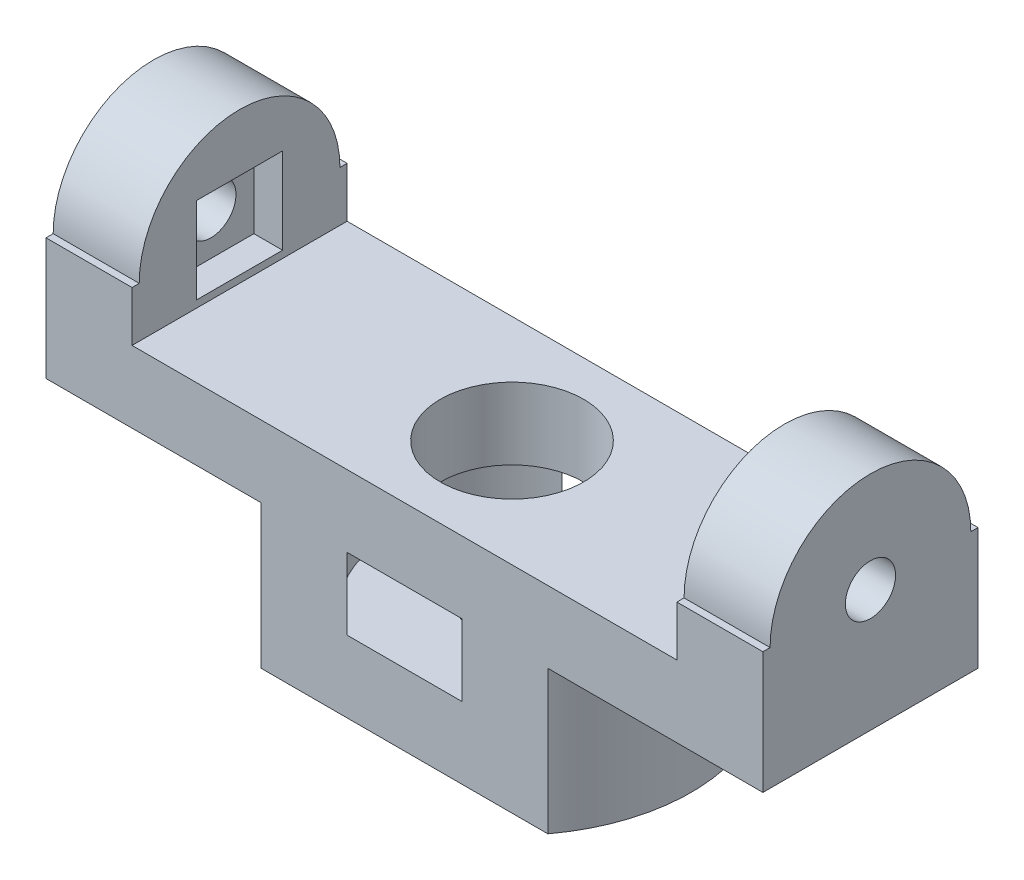
ISO-10303-21;
HEADER;
FILE_DESCRIPTION(('STEP AP214'),'2;1');
FILE_NAME('part.step','',(''),(''),'','','');
FILE_SCHEMA(('AUTOMOTIVE_DESIGN { 1 0 10303 214 1 1 1 1 }'));
ENDSEC;
DATA;
#1=APPLICATION_CONTEXT('core data for automotive mechanical design processes');
#2=APPLICATION_PROTOCOL_DEFINITION('international standard','automotive_design',2000,#1);
#3=PRODUCT_CONTEXT('',#1,'mechanical');
#4=PRODUCT('Part','Part','',(#3));
#5=PRODUCT_RELATED_PRODUCT_CATEGORY('part','',(#4));
#6=PRODUCT_DEFINITION_FORMATION('','',#4);
#7=PRODUCT_DEFINITION_CONTEXT('part definition',#1,'design');
#8=PRODUCT_DEFINITION('design','',#6,#7);
#9=PRODUCT_DEFINITION_SHAPE('','',#8);
#10=(LENGTH_UNIT() NAMED_UNIT(*) SI_UNIT(.MILLI.,.METRE.));
#11=(NAMED_UNIT(*) PLANE_ANGLE_UNIT() SI_UNIT($,.RADIAN.));
#12=(NAMED_UNIT(*) SI_UNIT($,.STERADIAN.) SOLID_ANGLE_UNIT());
#13=UNCERTAINTY_MEASURE_WITH_UNIT(LENGTH_MEASURE(1.E-05),#10,'distance_accuracy_value','');
#14=(GEOMETRIC_REPRESENTATION_CONTEXT(3) GLOBAL_UNCERTAINTY_ASSIGNED_CONTEXT((#13)) GLOBAL_UNIT_ASSIGNED_CONTEXT((#10,
#11,#12)) REPRESENTATION_CONTEXT('',''));
#15=CARTESIAN_POINT('',(0.,0.,0.));
#16=DIRECTION('',(0.,0.,1.));
#17=DIRECTION('',(1.,0.,0.));
#18=AXIS2_PLACEMENT_3D('',#15,#16,#17);
#19=CARTESIAN_POINT('',(0.,8.49999999999995,7.5));
#20=DIRECTION('',(1.,0.,0.));
#21=DIRECTION('',(0.,1.,0.));
#22=AXIS2_PLACEMENT_3D('',#19,#20,#21);
#23=CYLINDRICAL_SURFACE('',#22,1.75);
#24=CARTESIAN_POINT('',(0.,8.49999999999995,7.5));
#25=DIRECTION('',(1.,0.,0.));
#26=DIRECTION('',(0.,1.,0.));
#27=AXIS2_PLACEMENT_3D('',#24,#25,#26);
#28=CIRCLE('',#27,1.75);
#29=CARTESIAN_POINT('',(0.,10.25,7.5));
#30=VERTEX_POINT('',#29);
#31=EDGE_CURVE('E432',#30,#30,#28,.T.);
#32=ORIENTED_EDGE('',*,*,#31,.F.);
#33=EDGE_LOOP('',(#32));
#34=FACE_BOUND('',#33,.T.);
#35=CARTESIAN_POINT('',(4.,8.49999999999996,7.5));
#36=DIRECTION('',(1.,0.,0.));
#37=DIRECTION('',(0.,1.,0.));
#38=AXIS2_PLACEMENT_3D('',#35,#36,#37);
#39=CIRCLE('',#38,1.75);
#40=CARTESIAN_POINT('',(4.,10.25,7.5));
#41=VERTEX_POINT('',#40);
#42=EDGE_CURVE('E43',#41,#41,#39,.F.);
#43=ORIENTED_EDGE('',*,*,#42,.F.);
#44=EDGE_LOOP('',(#43));
#45=FACE_BOUND('',#44,.T.);
#46=ADVANCED_FACE('F39',(#34,#45),#23,.F.);
#47=CARTESIAN_POINT('',(50.,8.49999999999998,7.5));
#48=DIRECTION('',(1.,0.,0.));
#49=DIRECTION('',(0.,1.,0.));
#50=AXIS2_PLACEMENT_3D('',#47,#48,#49);
#51=CIRCLE('',#50,1.75);
#52=CARTESIAN_POINT('',(50.,10.25,7.5));
#53=VERTEX_POINT('',#52);
#54=EDGE_CURVE('E426',#53,#53,#51,.T.);
#55=ORIENTED_EDGE('',*,*,#54,.T.);
#56=EDGE_LOOP('',(#55));
#57=FACE_BOUND('',#56,.T.);
#58=CARTESIAN_POINT('',(46.,8.49999999999998,7.5));
#59=DIRECTION('',(-1.,0.,0.));
#60=DIRECTION('',(0.,-1.,0.));
#61=AXIS2_PLACEMENT_3D('',#58,#59,#60);
#62=CIRCLE('',#61,1.75);
#63=CARTESIAN_POINT('',(46.,6.74999999999997,7.5));
#64=VERTEX_POINT('',#63);
#65=EDGE_CURVE('E311',#64,#64,#62,.F.);
#66=ORIENTED_EDGE('',*,*,#65,.F.);
#67=EDGE_LOOP('',(#66));
#68=FACE_BOUND('',#67,.T.);
#69=ADVANCED_FACE('F541',(#57,#68),#23,.F.);
#70=CARTESIAN_POINT('',(25.,-10.,7.5));
#71=DIRECTION('',(0.,1.,0.));
#72=DIRECTION('',(-1.,0.,0.));
#73=AXIS2_PLACEMENT_3D('',#70,#71,#72);
#74=CYLINDRICAL_SURFACE('',#73,8.5);
#75=CARTESIAN_POINT('',(25.,-5.,7.5));
#76=DIRECTION('',(0.,-1.,0.));
#77=DIRECTION('',(1.,0.,0.));
#78=AXIS2_PLACEMENT_3D('',#75,#76,#77);
#79=CIRCLE('',#78,8.5);
#80=CARTESIAN_POINT('',(21.,-5.,0.));
#81=VERTEX_POINT('',#80);
#82=CARTESIAN_POINT('',(21.,-5.,15.));
#83=VERTEX_POINT('',#82);
#84=EDGE_CURVE('E341',#81,#83,#79,.F.);
#85=ORIENTED_EDGE('',*,*,#84,.F.);
#86=DIRECTION('',(0.,1.,0.));
#87=VECTOR('',#86,1.);
#88=CARTESIAN_POINT('',(21.,-10.,0.));
#89=LINE('',#88,#87);
#90=CARTESIAN_POINT('',(21.,0.,0.));
#91=VERTEX_POINT('',#90);
#92=EDGE_CURVE('E392',#81,#91,#89,.T.);
#93=ORIENTED_EDGE('',*,*,#92,.T.);
#94=CARTESIAN_POINT('',(25.,0.,7.5));
#95=DIRECTION('',(0.,1.,0.));
#96=DIRECTION('',(1.,0.,0.));
#97=AXIS2_PLACEMENT_3D('',#94,#95,#96);
#98=CIRCLE('',#97,8.5);
#99=CARTESIAN_POINT('',(21.,0.,15.));
#100=VERTEX_POINT('',#99);
#101=EDGE_CURVE('E374',#91,#100,#98,.T.);
#102=ORIENTED_EDGE('',*,*,#101,.T.);
#103=DIRECTION('',(0.,1.,0.));
#104=VECTOR('',#103,1.);
#105=CARTESIAN_POINT('',(21.,-10.,15.));
#106=LINE('',#105,#104);
#107=EDGE_CURVE('E389',#83,#100,#106,.T.);
#108=ORIENTED_EDGE('',*,*,#107,.F.);
#109=EDGE_LOOP('',(#85,#93,#102,#108));
#110=FACE_BOUND('',#109,.T.);
#111=ADVANCED_FACE('F543',(#110),#74,.F.);
#112=CARTESIAN_POINT('',(25.,-10.,7.5));
#113=DIRECTION('',(0.,1.,0.));
#114=DIRECTION('',(-1.,0.,0.));
#115=AXIS2_PLACEMENT_3D('',#112,#113,#114);
#116=CYLINDRICAL_SURFACE('',#115,8.5);
#117=CARTESIAN_POINT('',(25.,-5.,7.5));
#118=DIRECTION('',(0.,-1.,0.));
#119=DIRECTION('',(1.,0.,0.));
#120=AXIS2_PLACEMENT_3D('',#117,#118,#119);
#121=CIRCLE('',#120,8.5);
#122=CARTESIAN_POINT('',(29.,-5.,15.));
#123=VERTEX_POINT('',#122);
#124=CARTESIAN_POINT('',(29.,-5.,0.));
#125=VERTEX_POINT('',#124);
#126=EDGE_CURVE('E11',#123,#125,#121,.F.);
#127=ORIENTED_EDGE('',*,*,#126,.F.);
#128=DIRECTION('',(0.,1.,0.));
#129=VECTOR('',#128,1.);
#130=CARTESIAN_POINT('',(29.,-10.,15.));
#131=LINE('',#130,#129);
#132=CARTESIAN_POINT('',(29.,0.,15.));
#133=VERTEX_POINT('',#132);
#134=EDGE_CURVE('E362',#123,#133,#131,.T.);
#135=ORIENTED_EDGE('',*,*,#134,.T.);
#136=CARTESIAN_POINT('',(25.,0.,7.5));
#137=DIRECTION('',(0.,1.,0.));
#138=DIRECTION('',(1.,0.,0.));
#139=AXIS2_PLACEMENT_3D('',#136,#137,#138);
#140=CIRCLE('',#139,8.5);
#141=CARTESIAN_POINT('',(29.,0.,0.));
#142=VERTEX_POINT('',#141);
#143=EDGE_CURVE('E350',#133,#142,#140,.T.);
#144=ORIENTED_EDGE('',*,*,#143,.T.);
#145=DIRECTION('',(0.,1.,0.));
#146=VECTOR('',#145,1.);
#147=CARTESIAN_POINT('',(29.,-10.,0.));
#148=LINE('',#147,#146);
#149=EDGE_CURVE('E359',#125,#142,#148,.T.);
#150=ORIENTED_EDGE('',*,*,#149,.F.);
#151=EDGE_LOOP('',(#127,#135,#144,#150));
#152=FACE_BOUND('',#151,.T.);
#153=ADVANCED_FACE('F550',(#152),#116,.F.);
#154=CARTESIAN_POINT('',(50.,0.,15.));
#155=DIRECTION('',(0.,1.,0.));
#156=DIRECTION('',(-1.,0.,0.));
#157=AXIS2_PLACEMENT_3D('',#154,#155,#156);
#158=PLANE('',#157);
#159=CARTESIAN_POINT('',(25.,0.,7.5));
#160=DIRECTION('',(0.,-1.,0.));
#161=DIRECTION('',(1.,0.,0.));
#162=AXIS2_PLACEMENT_3D('',#159,#160,#161);
#163=CIRCLE('',#162,12.5);
#164=CARTESIAN_POINT('',(35.,0.,0.));
#165=VERTEX_POINT('',#164);
#166=CARTESIAN_POINT('',(35.,0.,15.));
#167=VERTEX_POINT('',#166);
#168=EDGE_CURVE('E344',#165,#167,#163,.T.);
#169=ORIENTED_EDGE('',*,*,#168,.F.);
#170=DIRECTION('',(1.,0.,0.));
#171=VECTOR('',#170,1.);
#172=CARTESIAN_POINT('',(50.,0.,0.));
#173=LINE('',#172,#171);
#174=CARTESIAN_POINT('',(50.,0.,0.));
#175=VERTEX_POINT('',#174);
#176=EDGE_CURVE('E463',#165,#175,#173,.T.);
#177=ORIENTED_EDGE('',*,*,#176,.T.);
#178=DIRECTION('',(0.,0.,-1.));
#179=VECTOR('',#178,1.);
#180=CARTESIAN_POINT('',(50.,0.,15.));
#181=LINE('',#180,#179);
#182=CARTESIAN_POINT('',(50.,0.,15.));
#183=VERTEX_POINT('',#182);
#184=EDGE_CURVE('E521',#183,#175,#181,.T.);
#185=ORIENTED_EDGE('',*,*,#184,.F.);
#186=DIRECTION('',(1.,0.,0.));
#187=VECTOR('',#186,1.);
#188=CARTESIAN_POINT('',(50.,0.,15.));
#189=LINE('',#188,#187);
#190=EDGE_CURVE('E470',#167,#183,#189,.T.);
#191=ORIENTED_EDGE('',*,*,#190,.F.);
#192=EDGE_LOOP('',(#169,#177,#185,#191));
#193=FACE_BOUND('',#192,.T.);
#194=ADVANCED_FACE('F590',(#193),#158,.F.);
#195=CARTESIAN_POINT('',(25.,0.,7.5));
#196=DIRECTION('',(0.,1.,0.));
#197=DIRECTION('',(-1.,0.,0.));
#198=AXIS2_PLACEMENT_3D('',#195,#196,#197);
#199=CIRCLE('',#198,5.);
#200=CARTESIAN_POINT('',(20.,0.,7.5));
#201=VERTEX_POINT('',#200);
#202=EDGE_CURVE('E324',#201,#201,#199,.F.);
#203=ORIENTED_EDGE('',*,*,#202,.F.);
#204=EDGE_LOOP('',(#203));
#205=FACE_BOUND('',#204,.T.);
#206=ORIENTED_EDGE('',*,*,#143,.F.);
#207=EDGE_CURVE('E469',#100,#133,#189,.T.);
#208=ORIENTED_EDGE('',*,*,#207,.F.);
#209=ORIENTED_EDGE('',*,*,#101,.F.);
#210=EDGE_CURVE('E493',#91,#142,#173,.T.);
#211=ORIENTED_EDGE('',*,*,#210,.T.);
#212=EDGE_LOOP('',(#206,#208,#209,#211));
#213=FACE_BOUND('',#212,.T.);
#214=ADVANCED_FACE('F588',(#205,#213),#158,.F.);
#215=CARTESIAN_POINT('',(25.,0.,7.5));
#216=DIRECTION('',(0.,-1.,0.));
#217=DIRECTION('',(1.,0.,0.));
#218=AXIS2_PLACEMENT_3D('',#215,#216,#217);
#219=CIRCLE('',#218,12.5);
#220=CARTESIAN_POINT('',(15.,0.,15.));
#221=VERTEX_POINT('',#220);
#222=CARTESIAN_POINT('',(15.,0.,0.));
#223=VERTEX_POINT('',#222);
#224=EDGE_CURVE('E368',#221,#223,#219,.T.);
#225=ORIENTED_EDGE('',*,*,#224,.F.);
#226=CARTESIAN_POINT('',(0.,0.,15.));
#227=VERTEX_POINT('',#226);
#228=EDGE_CURVE('E464',#227,#221,#189,.T.);
#229=ORIENTED_EDGE('',*,*,#228,.F.);
#230=DIRECTION('',(0.,0.,-1.));
#231=VECTOR('',#230,1.);
#232=CARTESIAN_POINT('',(0.,0.,15.));
#233=LINE('',#232,#231);
#234=CARTESIAN_POINT('',(0.,0.,0.));
#235=VERTEX_POINT('',#234);
#236=EDGE_CURVE('E487',#227,#235,#233,.T.);
#237=ORIENTED_EDGE('',*,*,#236,.T.);
#238=EDGE_CURVE('E488',#235,#223,#173,.T.);
#239=ORIENTED_EDGE('',*,*,#238,.T.);
#240=EDGE_LOOP('',(#225,#229,#237,#239));
#241=FACE_BOUND('',#240,.T.);
#242=ADVANCED_FACE('F41',(#241),#158,.F.);
#243=CARTESIAN_POINT('',(50.,16.,15.));
#244=DIRECTION('',(-1.,0.,0.));
#245=DIRECTION('',(0.,0.,1.));
#246=AXIS2_PLACEMENT_3D('',#243,#244,#245);
#247=PLANE('',#246);
#248=ORIENTED_EDGE('',*,*,#54,.F.);
#249=EDGE_LOOP('',(#248));
#250=FACE_BOUND('',#249,.T.);
#251=CARTESIAN_POINT('',(50.,8.49999999999998,7.5));
#252=DIRECTION('',(-1.,0.,0.));
#253=DIRECTION('',(0.,1.,0.));
#254=AXIS2_PLACEMENT_3D('',#251,#252,#253);
#255=CIRCLE('',#254,7.);
#256=CARTESIAN_POINT('',(50.,8.49999999999998,14.5));
#257=VERTEX_POINT('',#256);
#258=CARTESIAN_POINT('',(50.,8.49999999999998,0.5));
#259=VERTEX_POINT('',#258);
#260=EDGE_CURVE('E398',#257,#259,#255,.T.);
#261=ORIENTED_EDGE('',*,*,#260,.F.);
#262=DIRECTION('',(0.,0.,-1.));
#263=VECTOR('',#262,1.);
#264=CARTESIAN_POINT('',(50.,8.49999999999998,14.5));
#265=LINE('',#264,#263);
#266=CARTESIAN_POINT('',(50.,8.49999999999998,15.));
#267=VERTEX_POINT('',#266);
#268=EDGE_CURVE('E404',#267,#257,#265,.T.);
#269=ORIENTED_EDGE('',*,*,#268,.F.);
#270=DIRECTION('',(0.,1.,0.));
#271=VECTOR('',#270,1.);
#272=CARTESIAN_POINT('',(50.,16.,15.));
#273=LINE('',#272,#271);
#274=EDGE_CURVE('E468',#183,#267,#273,.T.);
#275=ORIENTED_EDGE('',*,*,#274,.F.);
#276=ORIENTED_EDGE('',*,*,#184,.T.);
#277=DIRECTION('',(0.,1.,0.));
#278=VECTOR('',#277,1.);
#279=CARTESIAN_POINT('',(50.,16.,0.));
#280=LINE('',#279,#278);
#281=CARTESIAN_POINT('',(50.,8.49999999999998,0.));
#282=VERTEX_POINT('',#281);
#283=EDGE_CURVE('E492',#175,#282,#280,.T.);
#284=ORIENTED_EDGE('',*,*,#283,.T.);
#285=DIRECTION('',(0.,0.,-1.));
#286=VECTOR('',#285,1.);
#287=CARTESIAN_POINT('',(50.,8.49999999999998,-5.90637808857718));
#288=LINE('',#287,#286);
#289=EDGE_CURVE('E416',#259,#282,#288,.T.);
#290=ORIENTED_EDGE('',*,*,#289,.F.);
#291=EDGE_LOOP('',(#261,#269,#275,#276,#284,#290));
#292=FACE_BOUND('',#291,.T.);
#293=ADVANCED_FACE('F581',(#250,#292),#247,.F.);
#294=CARTESIAN_POINT('',(44.,5.,15.));
#295=DIRECTION('',(1.,0.,0.));
#296=DIRECTION('',(0.,1.,0.));
#297=AXIS2_PLACEMENT_3D('',#294,#295,#296);
#298=PLANE('',#297);
#299=DIRECTION('',(0.,0.,-1.));
#300=VECTOR('',#299,1.);
#301=CARTESIAN_POINT('',(44.,11.4999999999999,4.5));
#302=LINE('',#301,#300);
#303=CARTESIAN_POINT('',(44.,11.4999999999999,10.5));
#304=VERTEX_POINT('',#303);
#305=CARTESIAN_POINT('',(44.,11.4999999999999,4.5));
#306=VERTEX_POINT('',#305);
#307=EDGE_CURVE('E297',#304,#306,#302,.T.);
#308=ORIENTED_EDGE('',*,*,#307,.F.);
#309=DIRECTION('',(0.,1.,0.));
#310=VECTOR('',#309,1.);
#311=CARTESIAN_POINT('',(44.,11.4999999999999,10.5));
#312=LINE('',#311,#310);
#313=CARTESIAN_POINT('',(44.,5.49999999999993,10.5));
#314=VERTEX_POINT('',#313);
#315=EDGE_CURVE('E65',#314,#304,#312,.T.);
#316=ORIENTED_EDGE('',*,*,#315,.F.);
#317=DIRECTION('',(0.,0.,1.));
#318=VECTOR('',#317,1.);
#319=CARTESIAN_POINT('',(44.,5.49999999999993,4.5));
#320=LINE('',#319,#318);
#321=CARTESIAN_POINT('',(44.,5.49999999999993,4.5));
#322=VERTEX_POINT('',#321);
#323=EDGE_CURVE('E282',#322,#314,#320,.T.);
#324=ORIENTED_EDGE('',*,*,#323,.F.);
#325=DIRECTION('',(0.,-1.,0.));
#326=VECTOR('',#325,1.);
#327=CARTESIAN_POINT('',(44.,11.4999999999999,4.5));
#328=LINE('',#327,#326);
#329=EDGE_CURVE('E301',#306,#322,#328,.T.);
#330=ORIENTED_EDGE('',*,*,#329,.F.);
#331=EDGE_LOOP('',(#308,#316,#324,#330));
#332=FACE_BOUND('',#331,.T.);
#333=DIRECTION('',(0.,-1.,0.));
#334=VECTOR('',#333,1.);
#335=CARTESIAN_POINT('',(44.,5.,15.));
#336=LINE('',#335,#334);
#337=CARTESIAN_POINT('',(44.,8.49999999999997,15.));
#338=VERTEX_POINT('',#337);
#339=CARTESIAN_POINT('',(44.,5.,15.));
#340=VERTEX_POINT('',#339);
#341=EDGE_CURVE('E474',#338,#340,#336,.T.);
#342=ORIENTED_EDGE('',*,*,#341,.F.);
#343=DIRECTION('',(0.,0.,-1.));
#344=VECTOR('',#343,1.);
#345=CARTESIAN_POINT('',(44.,8.49999999999997,15.));
#346=LINE('',#345,#344);
#347=CARTESIAN_POINT('',(44.,8.49999999999997,14.5));
#348=VERTEX_POINT('',#347);
#349=EDGE_CURVE('E451',#338,#348,#346,.T.);
#350=ORIENTED_EDGE('',*,*,#349,.T.);
#351=CARTESIAN_POINT('',(44.,8.49999999999997,7.5));
#352=DIRECTION('',(1.,0.,0.));
#353=DIRECTION('',(0.,1.,0.));
#354=AXIS2_PLACEMENT_3D('',#351,#352,#353);
#355=CIRCLE('',#354,7.);
#356=CARTESIAN_POINT('',(44.,8.49999999999998,0.5));
#357=VERTEX_POINT('',#356);
#358=EDGE_CURVE('E459',#348,#357,#355,.F.);
#359=ORIENTED_EDGE('',*,*,#358,.T.);
#360=DIRECTION('',(0.,0.,-1.));
#361=VECTOR('',#360,1.);
#362=CARTESIAN_POINT('',(44.,8.49999999999998,15.));
#363=LINE('',#362,#361);
#364=CARTESIAN_POINT('',(44.,8.49999999999998,0.));
#365=VERTEX_POINT('',#364);
#366=EDGE_CURVE('E443',#357,#365,#363,.T.);
#367=ORIENTED_EDGE('',*,*,#366,.T.);
#368=DIRECTION('',(0.,-1.,0.));
#369=VECTOR('',#368,1.);
#370=CARTESIAN_POINT('',(44.,5.,0.));
#371=LINE('',#370,#369);
#372=CARTESIAN_POINT('',(44.,5.,0.));
#373=VERTEX_POINT('',#372);
#374=EDGE_CURVE('E497',#365,#373,#371,.T.);
#375=ORIENTED_EDGE('',*,*,#374,.T.);
#376=DIRECTION('',(0.,0.,-1.));
#377=VECTOR('',#376,1.);
#378=CARTESIAN_POINT('',(44.,5.,15.));
#379=LINE('',#378,#377);
#380=EDGE_CURVE('E517',#340,#373,#379,.T.);
#381=ORIENTED_EDGE('',*,*,#380,.F.);
#382=EDGE_LOOP('',(#342,#350,#359,#367,#375,#381));
#383=FACE_BOUND('',#382,.T.);
#384=ADVANCED_FACE('F578',(#332,#383),#298,.F.);
#385=CARTESIAN_POINT('',(6.,5.,15.));
#386=DIRECTION('',(0.,-1.,0.));
#387=DIRECTION('',(1.,0.,0.));
#388=AXIS2_PLACEMENT_3D('',#385,#386,#387);
#389=PLANE('',#388);
#390=CARTESIAN_POINT('',(25.,5.,7.5));
#391=DIRECTION('',(0.,1.,0.));
#392=DIRECTION('',(-1.,0.,0.));
#393=AXIS2_PLACEMENT_3D('',#390,#391,#392);
#394=CIRCLE('',#393,5.);
#395=CARTESIAN_POINT('',(20.,5.,7.5));
#396=VERTEX_POINT('',#395);
#397=EDGE_CURVE('E320',#396,#396,#394,.T.);
#398=ORIENTED_EDGE('',*,*,#397,.F.);
#399=EDGE_LOOP('',(#398));
#400=FACE_BOUND('',#399,.T.);
#401=DIRECTION('',(-1.,0.,0.));
#402=VECTOR('',#401,1.);
#403=CARTESIAN_POINT('',(6.,5.,0.));
#404=LINE('',#403,#402);
#405=CARTESIAN_POINT('',(6.,5.,0.));
#406=VERTEX_POINT('',#405);
#407=EDGE_CURVE('E500',#373,#406,#404,.T.);
#408=ORIENTED_EDGE('',*,*,#407,.T.);
#409=DIRECTION('',(0.,0.,-1.));
#410=VECTOR('',#409,1.);
#411=CARTESIAN_POINT('',(6.,5.,15.));
#412=LINE('',#411,#410);
#413=CARTESIAN_POINT('',(6.,5.,15.));
#414=VERTEX_POINT('',#413);
#415=EDGE_CURVE('E513',#414,#406,#412,.T.);
#416=ORIENTED_EDGE('',*,*,#415,.F.);
#417=DIRECTION('',(-1.,0.,0.));
#418=VECTOR('',#417,1.);
#419=CARTESIAN_POINT('',(6.,5.,15.));
#420=LINE('',#419,#418);
#421=EDGE_CURVE('E477',#340,#414,#420,.T.);
#422=ORIENTED_EDGE('',*,*,#421,.F.);
#423=ORIENTED_EDGE('',*,*,#380,.T.);
#424=EDGE_LOOP('',(#408,#416,#422,#423));
#425=FACE_BOUND('',#424,.T.);
#426=ADVANCED_FACE('F574',(#400,#425),#389,.F.);
#427=CARTESIAN_POINT('',(6.,16.,15.));
#428=DIRECTION('',(-1.,0.,0.));
#429=DIRECTION('',(0.,-1.,0.));
#430=AXIS2_PLACEMENT_3D('',#427,#428,#429);
#431=PLANE('',#430);
#432=DIRECTION('',(0.,0.,1.));
#433=VECTOR('',#432,1.);
#434=CARTESIAN_POINT('',(6.,11.5,10.5));
#435=LINE('',#434,#433);
#436=CARTESIAN_POINT('',(6.,11.5,4.5));
#437=VERTEX_POINT('',#436);
#438=CARTESIAN_POINT('',(6.,11.5,10.5));
#439=VERTEX_POINT('',#438);
#440=EDGE_CURVE('E263',#437,#439,#435,.T.);
#441=ORIENTED_EDGE('',*,*,#440,.F.);
#442=DIRECTION('',(0.,1.,0.));
#443=VECTOR('',#442,1.);
#444=CARTESIAN_POINT('',(6.,11.5,4.5));
#445=LINE('',#444,#443);
#446=CARTESIAN_POINT('',(6.,5.49999999999997,4.5));
#447=VERTEX_POINT('',#446);
#448=EDGE_CURVE('E57',#447,#437,#445,.T.);
#449=ORIENTED_EDGE('',*,*,#448,.F.);
#450=DIRECTION('',(0.,0.,-1.));
#451=VECTOR('',#450,1.);
#452=CARTESIAN_POINT('',(6.,5.49999999999997,10.5));
#453=LINE('',#452,#451);
#454=CARTESIAN_POINT('',(6.,5.49999999999997,10.5));
#455=VERTEX_POINT('',#454);
#456=EDGE_CURVE('E250',#455,#447,#453,.T.);
#457=ORIENTED_EDGE('',*,*,#456,.F.);
#458=DIRECTION('',(0.,-1.,0.));
#459=VECTOR('',#458,1.);
#460=CARTESIAN_POINT('',(6.,11.5,10.5));
#461=LINE('',#460,#459);
#462=EDGE_CURVE('E254',#439,#455,#461,.T.);
#463=ORIENTED_EDGE('',*,*,#462,.F.);
#464=EDGE_LOOP('',(#441,#449,#457,#463));
#465=FACE_BOUND('',#464,.T.);
#466=CARTESIAN_POINT('',(6.,8.49999999999996,7.5));
#467=DIRECTION('',(-1.,0.,0.));
#468=DIRECTION('',(0.,-1.,0.));
#469=AXIS2_PLACEMENT_3D('',#466,#467,#468);
#470=CIRCLE('',#469,7.);
#471=CARTESIAN_POINT('',(6.,8.49999999999996,0.5));
#472=VERTEX_POINT('',#471);
#473=CARTESIAN_POINT('',(6.,8.49999999999996,14.5));
#474=VERTEX_POINT('',#473);
#475=EDGE_CURVE('E455',#472,#474,#470,.F.);
#476=ORIENTED_EDGE('',*,*,#475,.T.);
#477=DIRECTION('',(0.,0.,1.));
#478=VECTOR('',#477,1.);
#479=CARTESIAN_POINT('',(6.,8.49999999999996,15.));
#480=LINE('',#479,#478);
#481=CARTESIAN_POINT('',(6.,8.49999999999996,15.));
#482=VERTEX_POINT('',#481);
#483=EDGE_CURVE('E447',#474,#482,#480,.T.);
#484=ORIENTED_EDGE('',*,*,#483,.T.);
#485=DIRECTION('',(0.,1.,0.));
#486=VECTOR('',#485,1.);
#487=CARTESIAN_POINT('',(6.,16.,15.));
#488=LINE('',#487,#486);
#489=EDGE_CURVE('E480',#414,#482,#488,.T.);
#490=ORIENTED_EDGE('',*,*,#489,.F.);
#491=ORIENTED_EDGE('',*,*,#415,.T.);
#492=DIRECTION('',(0.,1.,0.));
#493=VECTOR('',#492,1.);
#494=CARTESIAN_POINT('',(6.,16.,0.));
#495=LINE('',#494,#493);
#496=CARTESIAN_POINT('',(6.,8.49999999999997,0.));
#497=VERTEX_POINT('',#496);
#498=EDGE_CURVE('E503',#406,#497,#495,.T.);
#499=ORIENTED_EDGE('',*,*,#498,.T.);
#500=DIRECTION('',(0.,0.,1.));
#501=VECTOR('',#500,1.);
#502=CARTESIAN_POINT('',(6.,8.49999999999996,15.));
#503=LINE('',#502,#501);
#504=EDGE_CURVE('E436',#497,#472,#503,.T.);
#505=ORIENTED_EDGE('',*,*,#504,.T.);
#506=EDGE_LOOP('',(#476,#484,#490,#491,#499,#505));
#507=FACE_BOUND('',#506,.T.);
#508=ADVANCED_FACE('F570',(#465,#507),#431,.F.);
#509=CARTESIAN_POINT('',(0.,0.,15.));
#510=DIRECTION('',(1.,0.,0.));
#511=DIRECTION('',(0.,0.,-1.));
#512=AXIS2_PLACEMENT_3D('',#509,#510,#511);
#513=PLANE('',#512);
#514=ORIENTED_EDGE('',*,*,#31,.T.);
#515=EDGE_LOOP('',(#514));
#516=FACE_BOUND('',#515,.T.);
#517=DIRECTION('',(0.,-1.,0.));
#518=VECTOR('',#517,1.);
#519=CARTESIAN_POINT('',(0.,0.,15.));
#520=LINE('',#519,#518);
#521=CARTESIAN_POINT('',(0.,8.49999999999995,15.));
#522=VERTEX_POINT('',#521);
#523=EDGE_CURVE('E484',#522,#227,#520,.T.);
#524=ORIENTED_EDGE('',*,*,#523,.F.);
#525=DIRECTION('',(0.,0.,-1.));
#526=VECTOR('',#525,1.);
#527=CARTESIAN_POINT('',(0.,8.49999999999995,14.5));
#528=LINE('',#527,#526);
#529=CARTESIAN_POINT('',(0.,8.49999999999995,14.5));
#530=VERTEX_POINT('',#529);
#531=EDGE_CURVE('E408',#522,#530,#528,.T.);
#532=ORIENTED_EDGE('',*,*,#531,.T.);
#533=CARTESIAN_POINT('',(0.,8.49999999999995,7.5));
#534=DIRECTION('',(-1.,0.,0.));
#535=DIRECTION('',(0.,1.,0.));
#536=AXIS2_PLACEMENT_3D('',#533,#534,#535);
#537=CIRCLE('',#536,7.);
#538=CARTESIAN_POINT('',(0.,8.49999999999996,0.5));
#539=VERTEX_POINT('',#538);
#540=EDGE_CURVE('E399',#530,#539,#537,.T.);
#541=ORIENTED_EDGE('',*,*,#540,.T.);
#542=DIRECTION('',(0.,0.,-1.));
#543=VECTOR('',#542,1.);
#544=CARTESIAN_POINT('',(0.,8.49999999999996,-5.90637808857718));
#545=LINE('',#544,#543);
#546=CARTESIAN_POINT('',(0.,8.49999999999996,0.));
#547=VERTEX_POINT('',#546);
#548=EDGE_CURVE('E403',#539,#547,#545,.T.);
#549=ORIENTED_EDGE('',*,*,#548,.T.);
#550=DIRECTION('',(0.,-1.,0.));
#551=VECTOR('',#550,1.);
#552=CARTESIAN_POINT('',(0.,0.,0.));
#553=LINE('',#552,#551);
#554=EDGE_CURVE('E507',#547,#235,#553,.T.);
#555=ORIENTED_EDGE('',*,*,#554,.T.);
#556=ORIENTED_EDGE('',*,*,#236,.F.);
#557=EDGE_LOOP('',(#524,#532,#541,#549,#555,#556));
#558=FACE_BOUND('',#557,.T.);
#559=ADVANCED_FACE('F562',(#516,#558),#513,.F.);
#560=CARTESIAN_POINT('',(0.,0.,15.));
#561=DIRECTION('',(0.,0.,-1.));
#562=DIRECTION('',(-1.,0.,0.));
#563=AXIS2_PLACEMENT_3D('',#560,#561,#562);
#564=PLANE('',#563);
#565=ORIENTED_EDGE('',*,*,#134,.F.);
#566=DIRECTION('',(-1.,0.,0.));
#567=VECTOR('',#566,1.);
#568=CARTESIAN_POINT('',(21.,-5.,15.));
#569=LINE('',#568,#567);
#570=EDGE_CURVE('E333',#123,#83,#569,.T.);
#571=ORIENTED_EDGE('',*,*,#570,.T.);
#572=ORIENTED_EDGE('',*,*,#107,.T.);
#573=ORIENTED_EDGE('',*,*,#207,.T.);
#574=EDGE_LOOP('',(#565,#571,#572,#573));
#575=FACE_BOUND('',#574,.T.);
#576=DIRECTION('',(-1.,0.,0.));
#577=VECTOR('',#576,1.);
#578=CARTESIAN_POINT('',(15.,-10.,15.));
#579=LINE('',#578,#577);
#580=CARTESIAN_POINT('',(35.,-10.,15.));
#581=VERTEX_POINT('',#580);
#582=CARTESIAN_POINT('',(15.,-10.,15.));
#583=VERTEX_POINT('',#582);
#584=EDGE_CURVE('E377',#581,#583,#579,.T.);
#585=ORIENTED_EDGE('',*,*,#584,.F.);
#586=DIRECTION('',(0.,1.,0.));
#587=VECTOR('',#586,1.);
#588=CARTESIAN_POINT('',(35.,-10.,15.));
#589=LINE('',#588,#587);
#590=EDGE_CURVE('E365',#581,#167,#589,.T.);
#591=ORIENTED_EDGE('',*,*,#590,.T.);
#592=ORIENTED_EDGE('',*,*,#190,.T.);
#593=ORIENTED_EDGE('',*,*,#274,.T.);
#594=DIRECTION('',(-1.,0.,0.));
#595=VECTOR('',#594,1.);
#596=CARTESIAN_POINT('',(0.,8.49999999999995,15.));
#597=LINE('',#596,#595);
#598=EDGE_CURVE('E49',#267,#338,#597,.T.);
#599=ORIENTED_EDGE('',*,*,#598,.T.);
#600=ORIENTED_EDGE('',*,*,#341,.T.);
#601=ORIENTED_EDGE('',*,*,#421,.T.);
#602=ORIENTED_EDGE('',*,*,#489,.T.);
#603=EDGE_CURVE('E529',#482,#522,#597,.T.);
#604=ORIENTED_EDGE('',*,*,#603,.T.);
#605=ORIENTED_EDGE('',*,*,#523,.T.);
#606=ORIENTED_EDGE('',*,*,#228,.T.);
#607=DIRECTION('',(0.,1.,0.));
#608=VECTOR('',#607,1.);
#609=CARTESIAN_POINT('',(15.,-10.,15.));
#610=LINE('',#609,#608);
#611=EDGE_CURVE('E380',#583,#221,#610,.T.);
#612=ORIENTED_EDGE('',*,*,#611,.F.);
#613=EDGE_LOOP('',(#585,#591,#592,#593,#599,#600,#601,#602,#604,#605,#606,#612));
#614=FACE_BOUND('',#613,.T.);
#615=ADVANCED_FACE('F558',(#575,#614),#564,.F.);
#616=CARTESIAN_POINT('',(0.,0.,0.));
#617=DIRECTION('',(0.,0.,-1.));
#618=DIRECTION('',(-1.,0.,0.));
#619=AXIS2_PLACEMENT_3D('',#616,#617,#618);
#620=PLANE('',#619);
#621=DIRECTION('',(1.,0.,0.));
#622=VECTOR('',#621,1.);
#623=CARTESIAN_POINT('',(15.,-5.,0.));
#624=LINE('',#623,#622);
#625=EDGE_CURVE('E337',#81,#125,#624,.T.);
#626=ORIENTED_EDGE('',*,*,#625,.T.);
#627=ORIENTED_EDGE('',*,*,#149,.T.);
#628=ORIENTED_EDGE('',*,*,#210,.F.);
#629=ORIENTED_EDGE('',*,*,#92,.F.);
#630=EDGE_LOOP('',(#626,#627,#628,#629));
#631=FACE_BOUND('',#630,.T.);
#632=DIRECTION('',(0.,1.,0.));
#633=VECTOR('',#632,1.);
#634=CARTESIAN_POINT('',(15.,-10.,0.));
#635=LINE('',#634,#633);
#636=CARTESIAN_POINT('',(15.,-10.,0.));
#637=VERTEX_POINT('',#636);
#638=EDGE_CURVE('E395',#637,#223,#635,.T.);
#639=ORIENTED_EDGE('',*,*,#638,.T.);
#640=ORIENTED_EDGE('',*,*,#238,.F.);
#641=ORIENTED_EDGE('',*,*,#554,.F.);
#642=DIRECTION('',(-1.,0.,0.));
#643=VECTOR('',#642,1.);
#644=CARTESIAN_POINT('',(0.,8.49999999999996,0.));
#645=LINE('',#644,#643);
#646=EDGE_CURVE('E525',#497,#547,#645,.T.);
#647=ORIENTED_EDGE('',*,*,#646,.F.);
#648=ORIENTED_EDGE('',*,*,#498,.F.);
#649=ORIENTED_EDGE('',*,*,#407,.F.);
#650=ORIENTED_EDGE('',*,*,#374,.F.);
#651=EDGE_CURVE('E528',#282,#365,#645,.T.);
#652=ORIENTED_EDGE('',*,*,#651,.F.);
#653=ORIENTED_EDGE('',*,*,#283,.F.);
#654=ORIENTED_EDGE('',*,*,#176,.F.);
#655=DIRECTION('',(0.,1.,0.));
#656=VECTOR('',#655,1.);
#657=CARTESIAN_POINT('',(35.,-10.,0.));
#658=LINE('',#657,#656);
#659=CARTESIAN_POINT('',(35.,-10.,0.));
#660=VERTEX_POINT('',#659);
#661=EDGE_CURVE('E349',#660,#165,#658,.T.);
#662=ORIENTED_EDGE('',*,*,#661,.F.);
#663=DIRECTION('',(1.,0.,0.));
#664=VECTOR('',#663,1.);
#665=CARTESIAN_POINT('',(15.,-10.,0.));
#666=LINE('',#665,#664);
#667=EDGE_CURVE('E373',#637,#660,#666,.T.);
#668=ORIENTED_EDGE('',*,*,#667,.F.);
#669=EDGE_LOOP('',(#639,#640,#641,#647,#648,#649,#650,#652,#653,#654,#662,#668));
#670=FACE_BOUND('',#669,.T.);
#671=ADVANCED_FACE('F561',(#631,#670),#620,.T.);
#672=CARTESIAN_POINT('',(0.,8.49999999999995,14.5));
#673=DIRECTION('',(0.,-1.,0.));
#674=DIRECTION('',(1.,0.,0.));
#675=AXIS2_PLACEMENT_3D('',#672,#673,#674);
#676=PLANE('',#675);
#677=DIRECTION('',(1.,0.,0.));
#678=VECTOR('',#677,1.);
#679=CARTESIAN_POINT('',(0.,8.49999999999995,14.5));
#680=LINE('',#679,#678);
#681=EDGE_CURVE('E422',#530,#474,#680,.T.);
#682=ORIENTED_EDGE('',*,*,#681,.F.);
#683=ORIENTED_EDGE('',*,*,#531,.F.);
#684=ORIENTED_EDGE('',*,*,#603,.F.);
#685=ORIENTED_EDGE('',*,*,#483,.F.);
#686=EDGE_LOOP('',(#682,#683,#684,#685));
#687=FACE_BOUND('',#686,.T.);
#688=ADVANCED_FACE('F566',(#687),#676,.F.);
#689=CARTESIAN_POINT('',(0.,8.49999999999996,-5.90637808857718));
#690=DIRECTION('',(0.,-1.,0.));
#691=DIRECTION('',(1.,0.,0.));
#692=AXIS2_PLACEMENT_3D('',#689,#690,#691);
#693=PLANE('',#692);
#694=ORIENTED_EDGE('',*,*,#646,.T.);
#695=ORIENTED_EDGE('',*,*,#548,.F.);
#696=DIRECTION('',(1.,0.,0.));
#697=VECTOR('',#696,1.);
#698=CARTESIAN_POINT('',(0.,8.49999999999996,0.5));
#699=LINE('',#698,#697);
#700=EDGE_CURVE('E428',#539,#472,#699,.T.);
#701=ORIENTED_EDGE('',*,*,#700,.T.);
#702=ORIENTED_EDGE('',*,*,#504,.F.);
#703=EDGE_LOOP('',(#694,#695,#701,#702));
#704=FACE_BOUND('',#703,.T.);
#705=ADVANCED_FACE('F658',(#704),#693,.F.);
#706=CARTESIAN_POINT('',(0.,8.49999999999995,7.5));
#707=DIRECTION('',(1.,0.,0.));
#708=DIRECTION('',(0.,1.,0.));
#709=AXIS2_PLACEMENT_3D('',#706,#707,#708);
#710=CYLINDRICAL_SURFACE('',#709,7.);
#711=ORIENTED_EDGE('',*,*,#700,.F.);
#712=ORIENTED_EDGE('',*,*,#540,.F.);
#713=ORIENTED_EDGE('',*,*,#681,.T.);
#714=ORIENTED_EDGE('',*,*,#475,.F.);
#715=EDGE_LOOP('',(#711,#712,#713,#714));
#716=FACE_BOUND('',#715,.T.);
#717=ADVANCED_FACE('F661',(#716),#710,.T.);
#718=EDGE_CURVE('E427',#348,#257,#680,.T.);
#719=ORIENTED_EDGE('',*,*,#718,.T.);
#720=ORIENTED_EDGE('',*,*,#260,.T.);
#721=EDGE_CURVE('E412',#357,#259,#699,.T.);
#722=ORIENTED_EDGE('',*,*,#721,.F.);
#723=ORIENTED_EDGE('',*,*,#358,.F.);
#724=EDGE_LOOP('',(#719,#720,#722,#723));
#725=FACE_BOUND('',#724,.T.);
#726=ADVANCED_FACE('F556',(#725),#710,.T.);
#727=ORIENTED_EDGE('',*,*,#598,.F.);
#728=ORIENTED_EDGE('',*,*,#268,.T.);
#729=ORIENTED_EDGE('',*,*,#718,.F.);
#730=ORIENTED_EDGE('',*,*,#349,.F.);
#731=EDGE_LOOP('',(#727,#728,#729,#730));
#732=FACE_BOUND('',#731,.T.);
#733=ADVANCED_FACE('F602',(#732),#676,.F.);
#734=ORIENTED_EDGE('',*,*,#721,.T.);
#735=ORIENTED_EDGE('',*,*,#289,.T.);
#736=ORIENTED_EDGE('',*,*,#651,.T.);
#737=ORIENTED_EDGE('',*,*,#366,.F.);
#738=EDGE_LOOP('',(#734,#735,#736,#737));
#739=FACE_BOUND('',#738,.T.);
#740=ADVANCED_FACE('F616',(#739),#693,.F.);
#741=CARTESIAN_POINT('',(25.,-10.,7.5));
#742=DIRECTION('',(0.,1.,0.));
#743=DIRECTION('',(-1.,0.,0.));
#744=AXIS2_PLACEMENT_3D('',#741,#742,#743);
#745=CYLINDRICAL_SURFACE('',#744,12.5);
#746=ORIENTED_EDGE('',*,*,#611,.T.);
#747=ORIENTED_EDGE('',*,*,#224,.T.);
#748=ORIENTED_EDGE('',*,*,#638,.F.);
#749=CARTESIAN_POINT('',(25.,-10.,7.5));
#750=DIRECTION('',(0.,-1.,0.));
#751=DIRECTION('',(1.,0.,0.));
#752=AXIS2_PLACEMENT_3D('',#749,#750,#751);
#753=CIRCLE('',#752,12.5);
#754=EDGE_CURVE('E369',#583,#637,#753,.T.);
#755=ORIENTED_EDGE('',*,*,#754,.F.);
#756=EDGE_LOOP('',(#746,#747,#748,#755));
#757=FACE_BOUND('',#756,.T.);
#758=ADVANCED_FACE('F643',(#757),#745,.T.);
#759=CARTESIAN_POINT('',(25.,-10.,7.5));
#760=DIRECTION('',(0.,-1.,0.));
#761=DIRECTION('',(1.,0.,0.));
#762=AXIS2_PLACEMENT_3D('',#759,#760,#761);
#763=PLANE('',#762);
#764=CARTESIAN_POINT('',(25.,-10.,7.5));
#765=DIRECTION('',(0.,-1.,0.));
#766=DIRECTION('',(1.,0.,0.));
#767=AXIS2_PLACEMENT_3D('',#764,#765,#766);
#768=CIRCLE('',#767,2.75);
#769=CARTESIAN_POINT('',(27.75,-10.,7.5));
#770=VERTEX_POINT('',#769);
#771=EDGE_CURVE('E328',#770,#770,#768,.T.);
#772=ORIENTED_EDGE('',*,*,#771,.F.);
#773=EDGE_LOOP('',(#772));
#774=FACE_BOUND('',#773,.T.);
#775=ORIENTED_EDGE('',*,*,#754,.T.);
#776=ORIENTED_EDGE('',*,*,#667,.T.);
#777=CARTESIAN_POINT('',(25.,-10.,7.5));
#778=DIRECTION('',(0.,-1.,0.));
#779=DIRECTION('',(1.,0.,0.));
#780=AXIS2_PLACEMENT_3D('',#777,#778,#779);
#781=CIRCLE('',#780,12.5);
#782=EDGE_CURVE('E345',#660,#581,#781,.T.);
#783=ORIENTED_EDGE('',*,*,#782,.T.);
#784=ORIENTED_EDGE('',*,*,#584,.T.);
#785=EDGE_LOOP('',(#775,#776,#783,#784));
#786=FACE_BOUND('',#785,.T.);
#787=ADVANCED_FACE('F645',(#774,#786),#763,.T.);
#788=CARTESIAN_POINT('',(25.,-10.,7.5));
#789=DIRECTION('',(0.,1.,0.));
#790=DIRECTION('',(-1.,0.,0.));
#791=AXIS2_PLACEMENT_3D('',#788,#789,#790);
#792=CYLINDRICAL_SURFACE('',#791,12.5);
#793=ORIENTED_EDGE('',*,*,#661,.T.);
#794=ORIENTED_EDGE('',*,*,#168,.T.);
#795=ORIENTED_EDGE('',*,*,#590,.F.);
#796=ORIENTED_EDGE('',*,*,#782,.F.);
#797=EDGE_LOOP('',(#793,#794,#795,#796));
#798=FACE_BOUND('',#797,.T.);
#799=ADVANCED_FACE('F650',(#798),#792,.T.);
#800=CARTESIAN_POINT('',(25.,-5.,7.5));
#801=DIRECTION('',(0.,-1.,0.));
#802=DIRECTION('',(1.,0.,0.));
#803=AXIS2_PLACEMENT_3D('',#800,#801,#802);
#804=PLANE('',#803);
#805=CARTESIAN_POINT('',(25.,-5.,7.5));
#806=DIRECTION('',(0.,-1.,0.));
#807=DIRECTION('',(1.,0.,0.));
#808=AXIS2_PLACEMENT_3D('',#805,#806,#807);
#809=CIRCLE('',#808,2.75);
#810=CARTESIAN_POINT('',(27.75,-5.,7.5));
#811=VERTEX_POINT('',#810);
#812=EDGE_CURVE('E332',#811,#811,#809,.T.);
#813=ORIENTED_EDGE('',*,*,#812,.T.);
#814=EDGE_LOOP('',(#813));
#815=FACE_BOUND('',#814,.T.);
#816=ORIENTED_EDGE('',*,*,#625,.F.);
#817=ORIENTED_EDGE('',*,*,#84,.T.);
#818=ORIENTED_EDGE('',*,*,#570,.F.);
#819=ORIENTED_EDGE('',*,*,#126,.T.);
#820=EDGE_LOOP('',(#816,#817,#818,#819));
#821=FACE_BOUND('',#820,.T.);
#822=ADVANCED_FACE('F795',(#815,#821),#804,.F.);
#823=CARTESIAN_POINT('',(25.,12.778174593052,7.5));
#824=DIRECTION('',(0.,-1.,0.));
#825=DIRECTION('',(1.,0.,0.));
#826=AXIS2_PLACEMENT_3D('',#823,#824,#825);
#827=CYLINDRICAL_SURFACE('',#826,2.75);
#828=ORIENTED_EDGE('',*,*,#771,.T.);
#829=EDGE_LOOP('',(#828));
#830=FACE_BOUND('',#829,.T.);
#831=ORIENTED_EDGE('',*,*,#812,.F.);
#832=EDGE_LOOP('',(#831));
#833=FACE_BOUND('',#832,.T.);
#834=ADVANCED_FACE('F791',(#830,#833),#827,.F.);
#835=CARTESIAN_POINT('',(25.,-14.142135623731,7.5));
#836=DIRECTION('',(0.,1.,0.));
#837=DIRECTION('',(-1.,0.,0.));
#838=AXIS2_PLACEMENT_3D('',#835,#836,#837);
#839=CYLINDRICAL_SURFACE('',#838,5.);
#840=ORIENTED_EDGE('',*,*,#202,.T.);
#841=EDGE_LOOP('',(#840));
#842=FACE_BOUND('',#841,.T.);
#843=ORIENTED_EDGE('',*,*,#397,.T.);
#844=EDGE_LOOP('',(#843));
#845=FACE_BOUND('',#844,.T.);
#846=ADVANCED_FACE('F775',(#842,#845),#839,.F.);
#847=CARTESIAN_POINT('',(46.,0.,0.));
#848=DIRECTION('',(-1.,0.,0.));
#849=DIRECTION('',(0.,-1.,0.));
#850=AXIS2_PLACEMENT_3D('',#847,#848,#849);
#851=PLANE('',#850);
#852=DIRECTION('',(0.,1.,0.));
#853=VECTOR('',#852,1.);
#854=CARTESIAN_POINT('',(46.,11.4999999999999,10.5));
#855=LINE('',#854,#853);
#856=CARTESIAN_POINT('',(46.,5.49999999999993,10.5));
#857=VERTEX_POINT('',#856);
#858=CARTESIAN_POINT('',(46.,11.4999999999999,10.5));
#859=VERTEX_POINT('',#858);
#860=EDGE_CURVE('E277',#857,#859,#855,.T.);
#861=ORIENTED_EDGE('',*,*,#860,.T.);
#862=DIRECTION('',(0.,0.,-1.));
#863=VECTOR('',#862,1.);
#864=CARTESIAN_POINT('',(46.,11.4999999999999,4.5));
#865=LINE('',#864,#863);
#866=CARTESIAN_POINT('',(46.,11.4999999999999,4.5));
#867=VERTEX_POINT('',#866);
#868=EDGE_CURVE('E281',#859,#867,#865,.T.);
#869=ORIENTED_EDGE('',*,*,#868,.T.);
#870=DIRECTION('',(0.,-1.,0.));
#871=VECTOR('',#870,1.);
#872=CARTESIAN_POINT('',(46.,11.4999999999999,4.5));
#873=LINE('',#872,#871);
#874=CARTESIAN_POINT('',(46.,5.49999999999993,4.5));
#875=VERTEX_POINT('',#874);
#876=EDGE_CURVE('E286',#867,#875,#873,.T.);
#877=ORIENTED_EDGE('',*,*,#876,.T.);
#878=DIRECTION('',(0.,0.,1.));
#879=VECTOR('',#878,1.);
#880=CARTESIAN_POINT('',(46.,5.49999999999993,4.5));
#881=LINE('',#880,#879);
#882=EDGE_CURVE('E290',#875,#857,#881,.T.);
#883=ORIENTED_EDGE('',*,*,#882,.T.);
#884=EDGE_LOOP('',(#861,#869,#877,#883));
#885=FACE_BOUND('',#884,.T.);
#886=ORIENTED_EDGE('',*,*,#65,.T.);
#887=EDGE_LOOP('',(#886));
#888=FACE_BOUND('',#887,.T.);
#889=ADVANCED_FACE('F539',(#885,#888),#851,.T.);
#890=CARTESIAN_POINT('',(46.,11.4999999999999,10.5));
#891=DIRECTION('',(0.,0.,1.));
#892=DIRECTION('',(1.,0.,0.));
#893=AXIS2_PLACEMENT_3D('',#890,#891,#892);
#894=PLANE('',#893);
#895=ORIENTED_EDGE('',*,*,#315,.T.);
#896=DIRECTION('',(-1.,0.,0.));
#897=VECTOR('',#896,1.);
#898=CARTESIAN_POINT('',(46.,11.4999999999999,10.5));
#899=LINE('',#898,#897);
#900=EDGE_CURVE('E294',#859,#304,#899,.T.);
#901=ORIENTED_EDGE('',*,*,#900,.F.);
#902=ORIENTED_EDGE('',*,*,#860,.F.);
#903=DIRECTION('',(-1.,0.,0.));
#904=VECTOR('',#903,1.);
#905=CARTESIAN_POINT('',(46.,5.49999999999993,10.5));
#906=LINE('',#905,#904);
#907=EDGE_CURVE('E308',#857,#314,#906,.T.);
#908=ORIENTED_EDGE('',*,*,#907,.T.);
#909=EDGE_LOOP('',(#895,#901,#902,#908));
#910=FACE_BOUND('',#909,.T.);
#911=ADVANCED_FACE('F774',(#910),#894,.F.);
#912=CARTESIAN_POINT('',(46.,5.49999999999993,4.5));
#913=DIRECTION('',(0.,-1.,0.));
#914=DIRECTION('',(1.,0.,0.));
#915=AXIS2_PLACEMENT_3D('',#912,#913,#914);
#916=PLANE('',#915);
#917=ORIENTED_EDGE('',*,*,#323,.T.);
#918=ORIENTED_EDGE('',*,*,#907,.F.);
#919=ORIENTED_EDGE('',*,*,#882,.F.);
#920=DIRECTION('',(-1.,0.,0.));
#921=VECTOR('',#920,1.);
#922=CARTESIAN_POINT('',(46.,5.49999999999993,4.5));
#923=LINE('',#922,#921);
#924=EDGE_CURVE('E312',#875,#322,#923,.T.);
#925=ORIENTED_EDGE('',*,*,#924,.T.);
#926=EDGE_LOOP('',(#917,#918,#919,#925));
#927=FACE_BOUND('',#926,.T.);
#928=ADVANCED_FACE('F777',(#927),#916,.F.);
#929=CARTESIAN_POINT('',(46.,11.4999999999999,4.5));
#930=DIRECTION('',(0.,0.,-1.));
#931=DIRECTION('',(0.,1.,0.));
#932=AXIS2_PLACEMENT_3D('',#929,#930,#931);
#933=PLANE('',#932);
#934=ORIENTED_EDGE('',*,*,#329,.T.);
#935=ORIENTED_EDGE('',*,*,#924,.F.);
#936=ORIENTED_EDGE('',*,*,#876,.F.);
#937=DIRECTION('',(-1.,0.,0.));
#938=VECTOR('',#937,1.);
#939=CARTESIAN_POINT('',(46.,11.4999999999999,4.5));
#940=LINE('',#939,#938);
#941=EDGE_CURVE('E315',#867,#306,#940,.T.);
#942=ORIENTED_EDGE('',*,*,#941,.T.);
#943=EDGE_LOOP('',(#934,#935,#936,#942));
#944=FACE_BOUND('',#943,.T.);
#945=ADVANCED_FACE('F780',(#944),#933,.F.);
#946=CARTESIAN_POINT('',(46.,11.4999999999999,4.5));
#947=DIRECTION('',(0.,1.,0.));
#948=DIRECTION('',(-1.,0.,0.));
#949=AXIS2_PLACEMENT_3D('',#946,#947,#948);
#950=PLANE('',#949);
#951=ORIENTED_EDGE('',*,*,#307,.T.);
#952=ORIENTED_EDGE('',*,*,#941,.F.);
#953=ORIENTED_EDGE('',*,*,#868,.F.);
#954=ORIENTED_EDGE('',*,*,#900,.T.);
#955=EDGE_LOOP('',(#951,#952,#953,#954));
#956=FACE_BOUND('',#955,.T.);
#957=ADVANCED_FACE('F730',(#956),#950,.F.);
#958=CARTESIAN_POINT('',(4.,0.,0.));
#959=DIRECTION('',(1.,0.,0.));
#960=DIRECTION('',(0.,1.,0.));
#961=AXIS2_PLACEMENT_3D('',#958,#959,#960);
#962=PLANE('',#961);
#963=DIRECTION('',(0.,1.,0.));
#964=VECTOR('',#963,1.);
#965=CARTESIAN_POINT('',(4.,11.5,4.5));
#966=LINE('',#965,#964);
#967=CARTESIAN_POINT('',(4.,5.49999999999996,4.5));
#968=VERTEX_POINT('',#967);
#969=CARTESIAN_POINT('',(4.,11.5,4.5));
#970=VERTEX_POINT('',#969);
#971=EDGE_CURVE('E228',#968,#970,#966,.T.);
#972=ORIENTED_EDGE('',*,*,#971,.T.);
#973=DIRECTION('',(0.,0.,1.));
#974=VECTOR('',#973,1.);
#975=CARTESIAN_POINT('',(4.,11.5,10.5));
#976=LINE('',#975,#974);
#977=CARTESIAN_POINT('',(4.,11.5,10.5));
#978=VERTEX_POINT('',#977);
#979=EDGE_CURVE('E238',#970,#978,#976,.T.);
#980=ORIENTED_EDGE('',*,*,#979,.T.);
#981=DIRECTION('',(0.,-1.,0.));
#982=VECTOR('',#981,1.);
#983=CARTESIAN_POINT('',(4.,11.5,10.5));
#984=LINE('',#983,#982);
#985=CARTESIAN_POINT('',(4.,5.49999999999996,10.5));
#986=VERTEX_POINT('',#985);
#987=EDGE_CURVE('E244',#978,#986,#984,.T.);
#988=ORIENTED_EDGE('',*,*,#987,.T.);
#989=DIRECTION('',(0.,0.,-1.));
#990=VECTOR('',#989,1.);
#991=CARTESIAN_POINT('',(4.,5.49999999999996,10.5));
#992=LINE('',#991,#990);
#993=EDGE_CURVE('E235',#986,#968,#992,.T.);
#994=ORIENTED_EDGE('',*,*,#993,.T.);
#995=EDGE_LOOP('',(#972,#980,#988,#994));
#996=FACE_BOUND('',#995,.T.);
#997=ORIENTED_EDGE('',*,*,#42,.T.);
#998=EDGE_LOOP('',(#997));
#999=FACE_BOUND('',#998,.T.);
#1000=ADVANCED_FACE('F246',(#996,#999),#962,.T.);
#1001=CARTESIAN_POINT('',(4.,11.5,4.5));
#1002=DIRECTION('',(0.,0.,-1.));
#1003=DIRECTION('',(0.,1.,0.));
#1004=AXIS2_PLACEMENT_3D('',#1001,#1002,#1003);
#1005=PLANE('',#1004);
#1006=ORIENTED_EDGE('',*,*,#448,.T.);
#1007=DIRECTION('',(1.,0.,0.));
#1008=VECTOR('',#1007,1.);
#1009=CARTESIAN_POINT('',(4.,11.5,4.5));
#1010=LINE('',#1009,#1008);
#1011=EDGE_CURVE('E224',#970,#437,#1010,.T.);
#1012=ORIENTED_EDGE('',*,*,#1011,.F.);
#1013=ORIENTED_EDGE('',*,*,#971,.F.);
#1014=DIRECTION('',(1.,0.,0.));
#1015=VECTOR('',#1014,1.);
#1016=CARTESIAN_POINT('',(4.,5.49999999999996,4.5));
#1017=LINE('',#1016,#1015);
#1018=EDGE_CURVE('E269',#968,#447,#1017,.T.);
#1019=ORIENTED_EDGE('',*,*,#1018,.T.);
#1020=EDGE_LOOP('',(#1006,#1012,#1013,#1019));
#1021=FACE_BOUND('',#1020,.T.);
#1022=ADVANCED_FACE('F226',(#1021),#1005,.F.);
#1023=CARTESIAN_POINT('',(4.,5.49999999999996,10.5));
#1024=DIRECTION('',(0.,-1.,0.));
#1025=DIRECTION('',(1.,0.,0.));
#1026=AXIS2_PLACEMENT_3D('',#1023,#1024,#1025);
#1027=PLANE('',#1026);
#1028=ORIENTED_EDGE('',*,*,#456,.T.);
#1029=ORIENTED_EDGE('',*,*,#1018,.F.);
#1030=ORIENTED_EDGE('',*,*,#993,.F.);
#1031=DIRECTION('',(1.,0.,0.));
#1032=VECTOR('',#1031,1.);
#1033=CARTESIAN_POINT('',(4.,5.49999999999996,10.5));
#1034=LINE('',#1033,#1032);
#1035=EDGE_CURVE('E272',#986,#455,#1034,.T.);
#1036=ORIENTED_EDGE('',*,*,#1035,.T.);
#1037=EDGE_LOOP('',(#1028,#1029,#1030,#1036));
#1038=FACE_BOUND('',#1037,.T.);
#1039=ADVANCED_FACE('F740',(#1038),#1027,.F.);
#1040=CARTESIAN_POINT('',(4.,11.5,10.5));
#1041=DIRECTION('',(0.,0.,1.));
#1042=DIRECTION('',(0.,-1.,0.));
#1043=AXIS2_PLACEMENT_3D('',#1040,#1041,#1042);
#1044=PLANE('',#1043);
#1045=ORIENTED_EDGE('',*,*,#462,.T.);
#1046=ORIENTED_EDGE('',*,*,#1035,.F.);
#1047=ORIENTED_EDGE('',*,*,#987,.F.);
#1048=DIRECTION('',(1.,0.,0.));
#1049=VECTOR('',#1048,1.);
#1050=CARTESIAN_POINT('',(4.,11.5,10.5));
#1051=LINE('',#1050,#1049);
#1052=EDGE_CURVE('E234',#978,#439,#1051,.T.);
#1053=ORIENTED_EDGE('',*,*,#1052,.T.);
#1054=EDGE_LOOP('',(#1045,#1046,#1047,#1053));
#1055=FACE_BOUND('',#1054,.T.);
#1056=ADVANCED_FACE('F749',(#1055),#1044,.F.);
#1057=CARTESIAN_POINT('',(4.,11.5,10.5));
#1058=DIRECTION('',(0.,1.,0.));
#1059=DIRECTION('',(-1.,0.,0.));
#1060=AXIS2_PLACEMENT_3D('',#1057,#1058,#1059);
#1061=PLANE('',#1060);
#1062=ORIENTED_EDGE('',*,*,#440,.T.);
#1063=ORIENTED_EDGE('',*,*,#1052,.F.);
#1064=ORIENTED_EDGE('',*,*,#979,.F.);
#1065=ORIENTED_EDGE('',*,*,#1011,.T.);
#1066=EDGE_LOOP('',(#1062,#1063,#1064,#1065));
#1067=FACE_BOUND('',#1066,.T.);
#1068=ADVANCED_FACE('F239',(#1067),#1061,.F.);
#1069=CLOSED_SHELL('',(#46,#69,#111,#153,#194,#214,#242,#293,#384,#426,#508,#559,#615,#671,#688,
#705,#717,#726,#733,#740,#758,#787,#799,#822,#834,#846,#889,#911,#928,#945,#957,#1000,#1022,
#1039,#1056,#1068));
#1070=MANIFOLD_SOLID_BREP('B2',#1069);
#1071=ADVANCED_BREP_SHAPE_REPRESENTATION('',(#18,#1070),#14);
#1072=SHAPE_DEFINITION_REPRESENTATION(#9,#1071);
ENDSEC;
END-ISO-10303-21;
